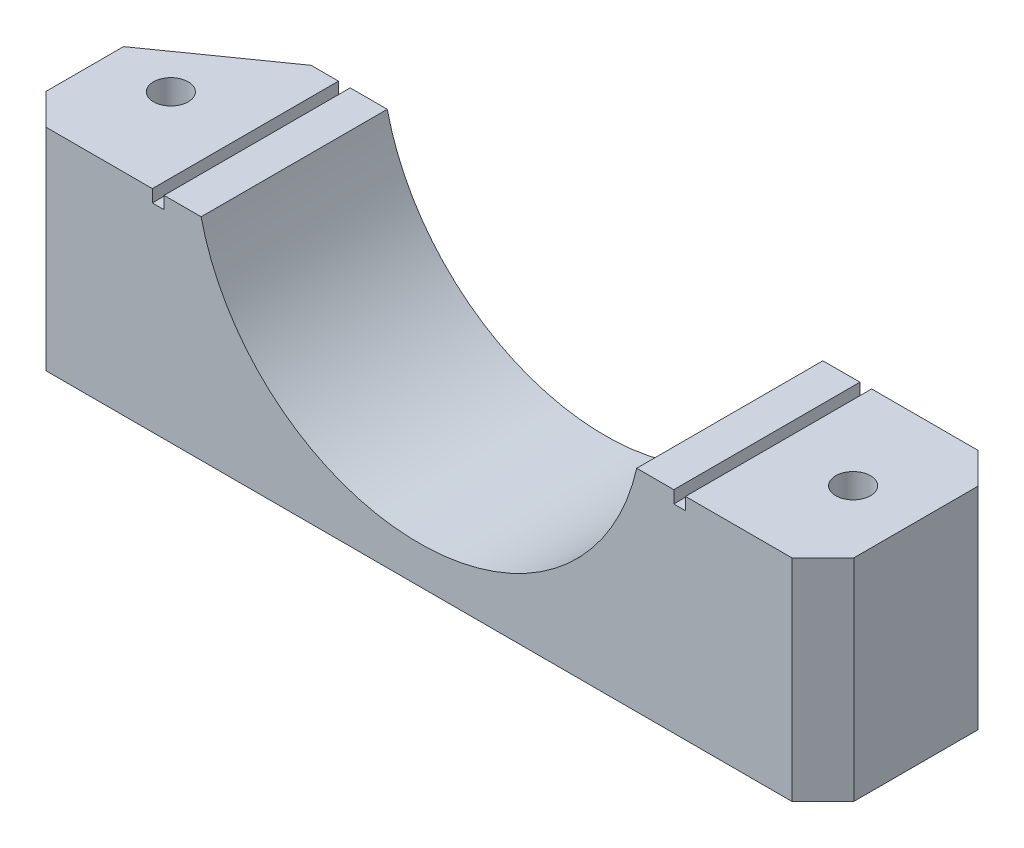
ISO-10303-21;
HEADER;
FILE_DESCRIPTION(('STEP AP214'),'2;1');
FILE_NAME('part.step','',(''),(''),'','','');
FILE_SCHEMA(('AUTOMOTIVE_DESIGN { 1 0 10303 214 1 1 1 1 }'));
ENDSEC;
DATA;
#1=APPLICATION_CONTEXT('core data for automotive mechanical design processes');
#2=APPLICATION_PROTOCOL_DEFINITION('international standard','automotive_design',2000,#1);
#3=PRODUCT_CONTEXT('',#1,'mechanical');
#4=PRODUCT('Part','Part','',(#3));
#5=PRODUCT_RELATED_PRODUCT_CATEGORY('part','',(#4));
#6=PRODUCT_DEFINITION_FORMATION('','',#4);
#7=PRODUCT_DEFINITION_CONTEXT('part definition',#1,'design');
#8=PRODUCT_DEFINITION('design','',#6,#7);
#9=PRODUCT_DEFINITION_SHAPE('','',#8);
#10=(LENGTH_UNIT() NAMED_UNIT(*) SI_UNIT(.MILLI.,.METRE.));
#11=(NAMED_UNIT(*) PLANE_ANGLE_UNIT() SI_UNIT($,.RADIAN.));
#12=(NAMED_UNIT(*) SI_UNIT($,.STERADIAN.) SOLID_ANGLE_UNIT());
#13=UNCERTAINTY_MEASURE_WITH_UNIT(LENGTH_MEASURE(1.E-05),#10,'distance_accuracy_value','');
#14=(GEOMETRIC_REPRESENTATION_CONTEXT(3) GLOBAL_UNCERTAINTY_ASSIGNED_CONTEXT((#13)) GLOBAL_UNIT_ASSIGNED_CONTEXT((#10,
#11,#12)) REPRESENTATION_CONTEXT('',''));
#15=CARTESIAN_POINT('',(0.,0.,0.));
#16=DIRECTION('',(0.,0.,1.));
#17=DIRECTION('',(1.,0.,0.));
#18=AXIS2_PLACEMENT_3D('',#15,#16,#17);
#19=CARTESIAN_POINT('',(32.5499287747842,-4.,15.));
#20=DIRECTION('',(0.,-1.,0.));
#21=DIRECTION('',(1.,0.,0.));
#22=AXIS2_PLACEMENT_3D('',#19,#20,#21);
#23=PLANE('',#22);
#24=CARTESIAN_POINT('',(27.4886444805463,-4.,7.50000000000003));
#25=DIRECTION('',(0.,1.,0.));
#26=DIRECTION('',(-1.,0.,0.));
#27=AXIS2_PLACEMENT_3D('',#24,#25,#26);
#28=CIRCLE('',#27,1.4);
#29=CARTESIAN_POINT('',(26.0886444805463,-4.,7.50000000000003));
#30=VERTEX_POINT('',#29);
#31=EDGE_CURVE('E292',#30,#30,#28,.T.);
#32=ORIENTED_EDGE('',*,*,#31,.F.);
#33=EDGE_LOOP('',(#32));
#34=FACE_BOUND('',#33,.T.);
#35=DIRECTION('',(0.,0.,1.));
#36=VECTOR('',#35,1.);
#37=CARTESIAN_POINT('',(21.4797362047984,-4.,0.));
#38=LINE('',#37,#36);
#39=CARTESIAN_POINT('',(21.4797362047984,-4.,0.));
#40=VERTEX_POINT('',#39);
#41=CARTESIAN_POINT('',(21.4797362047984,-4.,15.));
#42=VERTEX_POINT('',#41);
#43=EDGE_CURVE('E406',#40,#42,#38,.T.);
#44=ORIENTED_EDGE('',*,*,#43,.T.);
#45=DIRECTION('',(-1.,0.,0.));
#46=VECTOR('',#45,1.);
#47=CARTESIAN_POINT('',(32.5499287747842,-4.,15.));
#48=LINE('',#47,#46);
#49=CARTESIAN_POINT('',(30.0499287747842,-4.,15.));
#50=VERTEX_POINT('',#49);
#51=EDGE_CURVE('E190',#50,#42,#48,.T.);
#52=ORIENTED_EDGE('',*,*,#51,.F.);
#53=DIRECTION('',(0.707106781186548,0.,-0.707106781186548));
#54=VECTOR('',#53,1.);
#55=CARTESIAN_POINT('',(30.0499287747842,-4.,15.));
#56=LINE('',#55,#54);
#57=CARTESIAN_POINT('',(32.5499287747842,-4.,12.5));
#58=VERTEX_POINT('',#57);
#59=EDGE_CURVE('E218',#50,#58,#56,.T.);
#60=ORIENTED_EDGE('',*,*,#59,.T.);
#61=DIRECTION('',(0.,0.,-1.));
#62=VECTOR('',#61,1.);
#63=CARTESIAN_POINT('',(32.5499287747842,-4.,15.));
#64=LINE('',#63,#62);
#65=CARTESIAN_POINT('',(32.5499287747842,-4.,2.5));
#66=VERTEX_POINT('',#65);
#67=EDGE_CURVE('E210',#58,#66,#64,.T.);
#68=ORIENTED_EDGE('',*,*,#67,.T.);
#69=DIRECTION('',(0.707106781186548,0.,0.707106781186547));
#70=VECTOR('',#69,1.);
#71=CARTESIAN_POINT('',(32.5499287747842,-4.,2.5));
#72=LINE('',#71,#70);
#73=CARTESIAN_POINT('',(30.0499287747842,-4.,0.));
#74=VERTEX_POINT('',#73);
#75=EDGE_CURVE('E220',#66,#74,#72,.F.);
#76=ORIENTED_EDGE('',*,*,#75,.T.);
#77=DIRECTION('',(-1.,0.,0.));
#78=VECTOR('',#77,1.);
#79=CARTESIAN_POINT('',(32.5499287747842,-4.,0.));
#80=LINE('',#79,#78);
#81=EDGE_CURVE('E262',#74,#40,#80,.T.);
#82=ORIENTED_EDGE('',*,*,#81,.T.);
#83=EDGE_LOOP('',(#44,#52,#60,#68,#76,#82));
#84=FACE_BOUND('',#83,.T.);
#85=ADVANCED_FACE('F43',(#34,#84),#23,.F.);
#86=CARTESIAN_POINT('',(-17.5499287747842,-4.,15.));
#87=DIRECTION('',(0.,-1.,0.));
#88=DIRECTION('',(1.,0.,0.));
#89=AXIS2_PLACEMENT_3D('',#86,#87,#88);
#90=PLANE('',#89);
#91=DIRECTION('',(0.,0.,1.));
#92=VECTOR('',#91,1.);
#93=CARTESIAN_POINT('',(-20.5370518572524,-4.,0.));
#94=LINE('',#93,#92);
#95=CARTESIAN_POINT('',(-20.5370518572524,-4.,0.));
#96=VERTEX_POINT('',#95);
#97=CARTESIAN_POINT('',(-20.5370518572524,-4.,15.));
#98=VERTEX_POINT('',#97);
#99=EDGE_CURVE('E324',#96,#98,#94,.T.);
#100=ORIENTED_EDGE('',*,*,#99,.T.);
#101=DIRECTION('',(-1.,0.,0.));
#102=VECTOR('',#101,1.);
#103=CARTESIAN_POINT('',(-17.5499287747842,-4.,15.));
#104=LINE('',#103,#102);
#105=CARTESIAN_POINT('',(-17.5499287747842,-4.,15.));
#106=VERTEX_POINT('',#105);
#107=EDGE_CURVE('E256',#106,#98,#104,.T.);
#108=ORIENTED_EDGE('',*,*,#107,.F.);
#109=DIRECTION('',(0.,0.,-1.));
#110=VECTOR('',#109,1.);
#111=CARTESIAN_POINT('',(-17.5499287747842,-4.,15.));
#112=LINE('',#111,#110);
#113=CARTESIAN_POINT('',(-17.5499287747842,-4.,0.));
#114=VERTEX_POINT('',#113);
#115=EDGE_CURVE('E205',#106,#114,#112,.T.);
#116=ORIENTED_EDGE('',*,*,#115,.T.);
#117=DIRECTION('',(-1.,0.,0.));
#118=VECTOR('',#117,1.);
#119=CARTESIAN_POINT('',(-17.5499287747842,-4.,0.));
#120=LINE('',#119,#118);
#121=EDGE_CURVE('E188',#114,#96,#120,.T.);
#122=ORIENTED_EDGE('',*,*,#121,.T.);
#123=EDGE_LOOP('',(#100,#108,#116,#122));
#124=FACE_BOUND('',#123,.T.);
#125=ADVANCED_FACE('F349',(#124),#90,.F.);
#126=CARTESIAN_POINT('',(32.5499287747842,-21.,15.));
#127=DIRECTION('',(-1.,0.,0.));
#128=DIRECTION('',(0.,0.,1.));
#129=AXIS2_PLACEMENT_3D('',#126,#127,#128);
#130=PLANE('',#129);
#131=DIRECTION('',(0.,0.,-1.));
#132=VECTOR('',#131,1.);
#133=CARTESIAN_POINT('',(32.5499287747842,-21.,15.));
#134=LINE('',#133,#132);
#135=CARTESIAN_POINT('',(32.5499287747842,-21.,12.5));
#136=VERTEX_POINT('',#135);
#137=CARTESIAN_POINT('',(32.5499287747842,-21.,2.5));
#138=VERTEX_POINT('',#137);
#139=EDGE_CURVE('E197',#136,#138,#134,.T.);
#140=ORIENTED_EDGE('',*,*,#139,.T.);
#141=DIRECTION('',(0.,1.,0.));
#142=VECTOR('',#141,1.);
#143=CARTESIAN_POINT('',(32.5499287747842,-21.,2.5));
#144=LINE('',#143,#142);
#145=EDGE_CURVE('E215',#138,#66,#144,.T.);
#146=ORIENTED_EDGE('',*,*,#145,.T.);
#147=ORIENTED_EDGE('',*,*,#67,.F.);
#148=DIRECTION('',(0.,-1.,0.));
#149=VECTOR('',#148,1.);
#150=CARTESIAN_POINT('',(32.5499287747842,-21.,12.5));
#151=LINE('',#150,#149);
#152=EDGE_CURVE('E213',#58,#136,#151,.T.);
#153=ORIENTED_EDGE('',*,*,#152,.T.);
#154=EDGE_LOOP('',(#140,#146,#147,#153));
#155=FACE_BOUND('',#154,.T.);
#156=ADVANCED_FACE('F351',(#155),#130,.F.);
#157=CARTESIAN_POINT('',(20.5370518572524,-4.,15.));
#158=VERTEX_POINT('',#157);
#159=CARTESIAN_POINT('',(17.5499287747842,-4.,15.));
#160=VERTEX_POINT('',#159);
#161=EDGE_CURVE('E187',#158,#160,#48,.T.);
#162=ORIENTED_EDGE('',*,*,#161,.F.);
#163=DIRECTION('',(0.,0.,1.));
#164=VECTOR('',#163,1.);
#165=CARTESIAN_POINT('',(20.5370518572524,-4.,0.));
#166=LINE('',#165,#164);
#167=CARTESIAN_POINT('',(20.5370518572524,-4.,0.));
#168=VERTEX_POINT('',#167);
#169=EDGE_CURVE('E314',#168,#158,#166,.T.);
#170=ORIENTED_EDGE('',*,*,#169,.F.);
#171=CARTESIAN_POINT('',(17.5499287747842,-4.,0.));
#172=VERTEX_POINT('',#171);
#173=EDGE_CURVE('E265',#168,#172,#80,.T.);
#174=ORIENTED_EDGE('',*,*,#173,.T.);
#175=DIRECTION('',(0.,0.,-1.));
#176=VECTOR('',#175,1.);
#177=CARTESIAN_POINT('',(17.5499287747842,-4.,15.));
#178=LINE('',#177,#176);
#179=EDGE_CURVE('E207',#160,#172,#178,.T.);
#180=ORIENTED_EDGE('',*,*,#179,.F.);
#181=EDGE_LOOP('',(#162,#170,#174,#180));
#182=FACE_BOUND('',#181,.T.);
#183=ADVANCED_FACE('F313',(#182),#23,.F.);
#184=CARTESIAN_POINT('',(0.,0.,15.));
#185=DIRECTION('',(0.,0.,-1.));
#186=DIRECTION('',(-1.,0.,0.));
#187=AXIS2_PLACEMENT_3D('',#184,#185,#186);
#188=CYLINDRICAL_SURFACE('',#187,18.);
#189=CARTESIAN_POINT('',(0.,0.,0.));
#190=DIRECTION('',(0.,0.,1.));
#191=DIRECTION('',(1.,0.,0.));
#192=AXIS2_PLACEMENT_3D('',#189,#190,#191);
#193=CIRCLE('',#192,18.);
#194=EDGE_CURVE('E264',#114,#172,#193,.T.);
#195=ORIENTED_EDGE('',*,*,#194,.F.);
#196=ORIENTED_EDGE('',*,*,#115,.F.);
#197=CARTESIAN_POINT('',(0.,0.,15.));
#198=DIRECTION('',(0.,0.,1.));
#199=DIRECTION('',(1.,0.,0.));
#200=AXIS2_PLACEMENT_3D('',#197,#198,#199);
#201=CIRCLE('',#200,18.);
#202=EDGE_CURVE('E300',#106,#160,#201,.T.);
#203=ORIENTED_EDGE('',*,*,#202,.T.);
#204=ORIENTED_EDGE('',*,*,#179,.T.);
#205=EDGE_LOOP('',(#195,#196,#203,#204));
#206=FACE_BOUND('',#205,.T.);
#207=ADVANCED_FACE('F304',(#206),#188,.F.);
#208=CARTESIAN_POINT('',(-27.4886444805463,-4.00000000000002,7.50000000000003));
#209=DIRECTION('',(0.,1.,0.));
#210=DIRECTION('',(1.,0.,0.));
#211=AXIS2_PLACEMENT_3D('',#208,#209,#210);
#212=CIRCLE('',#211,1.4);
#213=CARTESIAN_POINT('',(-26.0886444805463,-4.00000000000002,7.50000000000003));
#214=VERTEX_POINT('',#213);
#215=EDGE_CURVE('E295',#214,#214,#212,.T.);
#216=ORIENTED_EDGE('',*,*,#215,.F.);
#217=EDGE_LOOP('',(#216));
#218=FACE_BOUND('',#217,.T.);
#219=CARTESIAN_POINT('',(-21.4797362047984,-4.,0.));
#220=VERTEX_POINT('',#219);
#221=CARTESIAN_POINT('',(-23.6830969203936,-4.,0.));
#222=VERTEX_POINT('',#221);
#223=EDGE_CURVE('E193',#220,#222,#120,.T.);
#224=ORIENTED_EDGE('',*,*,#223,.T.);
#225=DIRECTION('',(-0.817355943758289,0.,0.576133023878164));
#226=VECTOR('',#225,1.);
#227=CARTESIAN_POINT('',(-26.6492930181239,-4.,2.09079476359242));
#228=LINE('',#227,#226);
#229=CARTESIAN_POINT('',(-32.5499287747842,-4.,6.25));
#230=VERTEX_POINT('',#229);
#231=EDGE_CURVE('E59',#222,#230,#228,.T.);
#232=ORIENTED_EDGE('',*,*,#231,.T.);
#233=DIRECTION('',(0.,0.,-1.));
#234=VECTOR('',#233,1.);
#235=CARTESIAN_POINT('',(-32.5499287747842,-4.,15.));
#236=LINE('',#235,#234);
#237=CARTESIAN_POINT('',(-32.5499287747842,-4.,12.5));
#238=VERTEX_POINT('',#237);
#239=EDGE_CURVE('E202',#238,#230,#236,.T.);
#240=ORIENTED_EDGE('',*,*,#239,.F.);
#241=DIRECTION('',(0.707106781186548,0.,0.707106781186548));
#242=VECTOR('',#241,1.);
#243=CARTESIAN_POINT('',(-30.0499287747842,-4.,15.));
#244=LINE('',#243,#242);
#245=CARTESIAN_POINT('',(-30.0499287747842,-4.,15.));
#246=VERTEX_POINT('',#245);
#247=EDGE_CURVE('E52',#238,#246,#244,.T.);
#248=ORIENTED_EDGE('',*,*,#247,.T.);
#249=CARTESIAN_POINT('',(-21.4797362047984,-4.,15.));
#250=VERTEX_POINT('',#249);
#251=EDGE_CURVE('E244',#250,#246,#104,.T.);
#252=ORIENTED_EDGE('',*,*,#251,.F.);
#253=DIRECTION('',(0.,0.,1.));
#254=VECTOR('',#253,1.);
#255=CARTESIAN_POINT('',(-21.4797362047984,-4.,0.));
#256=LINE('',#255,#254);
#257=EDGE_CURVE('E270',#220,#250,#256,.T.);
#258=ORIENTED_EDGE('',*,*,#257,.F.);
#259=EDGE_LOOP('',(#224,#232,#240,#248,#252,#258));
#260=FACE_BOUND('',#259,.T.);
#261=ADVANCED_FACE('F242',(#218,#260),#90,.F.);
#262=CARTESIAN_POINT('',(-32.5499287747842,-4.,15.));
#263=DIRECTION('',(1.,0.,0.));
#264=DIRECTION('',(0.,0.,-1.));
#265=AXIS2_PLACEMENT_3D('',#262,#263,#264);
#266=PLANE('',#265);
#267=ORIENTED_EDGE('',*,*,#239,.T.);
#268=DIRECTION('',(0.,-1.,0.));
#269=VECTOR('',#268,1.);
#270=CARTESIAN_POINT('',(-32.5499287747842,3.99999999999999,6.25));
#271=LINE('',#270,#269);
#272=CARTESIAN_POINT('',(-32.5499287747842,-21.,6.25));
#273=VERTEX_POINT('',#272);
#274=EDGE_CURVE('E180',#230,#273,#271,.T.);
#275=ORIENTED_EDGE('',*,*,#274,.T.);
#276=DIRECTION('',(0.,0.,-1.));
#277=VECTOR('',#276,1.);
#278=CARTESIAN_POINT('',(-32.5499287747842,-21.,15.));
#279=LINE('',#278,#277);
#280=CARTESIAN_POINT('',(-32.5499287747842,-21.,12.5));
#281=VERTEX_POINT('',#280);
#282=EDGE_CURVE('E179',#281,#273,#279,.T.);
#283=ORIENTED_EDGE('',*,*,#282,.F.);
#284=DIRECTION('',(0.,1.,0.));
#285=VECTOR('',#284,1.);
#286=CARTESIAN_POINT('',(-32.5499287747842,-4.,12.5));
#287=LINE('',#286,#285);
#288=EDGE_CURVE('E235',#281,#238,#287,.T.);
#289=ORIENTED_EDGE('',*,*,#288,.T.);
#290=EDGE_LOOP('',(#267,#275,#283,#289));
#291=FACE_BOUND('',#290,.T.);
#292=ADVANCED_FACE('F366',(#291),#266,.F.);
#293=CARTESIAN_POINT('',(-32.5499287747842,-21.,15.));
#294=DIRECTION('',(0.,1.,0.));
#295=DIRECTION('',(0.,0.,1.));
#296=AXIS2_PLACEMENT_3D('',#293,#294,#295);
#297=PLANE('',#296);
#298=CARTESIAN_POINT('',(27.4886444805463,-21.,7.50000000000003));
#299=DIRECTION('',(0.,1.,0.));
#300=DIRECTION('',(-1.,0.,0.));
#301=AXIS2_PLACEMENT_3D('',#298,#299,#300);
#302=CIRCLE('',#301,1.4);
#303=CARTESIAN_POINT('',(26.0886444805463,-21.,7.50000000000003));
#304=VERTEX_POINT('',#303);
#305=EDGE_CURVE('E289',#304,#304,#302,.T.);
#306=ORIENTED_EDGE('',*,*,#305,.T.);
#307=EDGE_LOOP('',(#306));
#308=FACE_BOUND('',#307,.T.);
#309=CARTESIAN_POINT('',(-27.4886444805463,-21.,7.50000000000003));
#310=DIRECTION('',(0.,1.,0.));
#311=DIRECTION('',(1.,0.,0.));
#312=AXIS2_PLACEMENT_3D('',#309,#310,#311);
#313=CIRCLE('',#312,1.4);
#314=CARTESIAN_POINT('',(-26.0886444805463,-21.,7.50000000000003));
#315=VERTEX_POINT('',#314);
#316=EDGE_CURVE('E281',#315,#315,#313,.T.);
#317=ORIENTED_EDGE('',*,*,#316,.T.);
#318=EDGE_LOOP('',(#317));
#319=FACE_BOUND('',#318,.T.);
#320=ORIENTED_EDGE('',*,*,#282,.T.);
#321=DIRECTION('',(-0.817355943758289,0.,0.576133023878164));
#322=VECTOR('',#321,1.);
#323=CARTESIAN_POINT('',(-23.6830969203936,-21.,0.));
#324=LINE('',#323,#322);
#325=CARTESIAN_POINT('',(-23.6830969203936,-21.,0.));
#326=VERTEX_POINT('',#325);
#327=EDGE_CURVE('E167',#326,#273,#324,.T.);
#328=ORIENTED_EDGE('',*,*,#327,.F.);
#329=DIRECTION('',(1.,0.,0.));
#330=VECTOR('',#329,1.);
#331=CARTESIAN_POINT('',(-32.5499287747842,-21.,0.));
#332=LINE('',#331,#330);
#333=CARTESIAN_POINT('',(30.0499287747842,-21.,0.));
#334=VERTEX_POINT('',#333);
#335=EDGE_CURVE('E176',#326,#334,#332,.T.);
#336=ORIENTED_EDGE('',*,*,#335,.T.);
#337=DIRECTION('',(-0.707106781186548,0.,-0.707106781186547));
#338=VECTOR('',#337,1.);
#339=CARTESIAN_POINT('',(32.5499287747842,-21.,2.5));
#340=LINE('',#339,#338);
#341=EDGE_CURVE('E227',#334,#138,#340,.F.);
#342=ORIENTED_EDGE('',*,*,#341,.T.);
#343=ORIENTED_EDGE('',*,*,#139,.F.);
#344=DIRECTION('',(-0.707106781186548,0.,0.707106781186548));
#345=VECTOR('',#344,1.);
#346=CARTESIAN_POINT('',(30.0499287747842,-21.,15.));
#347=LINE('',#346,#345);
#348=CARTESIAN_POINT('',(30.0499287747842,-21.,15.));
#349=VERTEX_POINT('',#348);
#350=EDGE_CURVE('E225',#136,#349,#347,.T.);
#351=ORIENTED_EDGE('',*,*,#350,.T.);
#352=DIRECTION('',(1.,0.,0.));
#353=VECTOR('',#352,1.);
#354=CARTESIAN_POINT('',(-32.5499287747842,-21.,15.));
#355=LINE('',#354,#353);
#356=CARTESIAN_POINT('',(-30.0499287747842,-21.,15.));
#357=VERTEX_POINT('',#356);
#358=EDGE_CURVE('E200',#357,#349,#355,.T.);
#359=ORIENTED_EDGE('',*,*,#358,.F.);
#360=DIRECTION('',(-0.707106781186548,0.,-0.707106781186548));
#361=VECTOR('',#360,1.);
#362=CARTESIAN_POINT('',(-30.0499287747842,-21.,15.));
#363=LINE('',#362,#361);
#364=EDGE_CURVE('E223',#357,#281,#363,.T.);
#365=ORIENTED_EDGE('',*,*,#364,.T.);
#366=EDGE_LOOP('',(#320,#328,#336,#342,#343,#351,#359,#365));
#367=FACE_BOUND('',#366,.T.);
#368=ADVANCED_FACE('F175',(#308,#319,#367),#297,.F.);
#369=CARTESIAN_POINT('',(0.,0.,15.));
#370=DIRECTION('',(0.,0.,1.));
#371=DIRECTION('',(1.,0.,0.));
#372=AXIS2_PLACEMENT_3D('',#369,#370,#371);
#373=PLANE('',#372);
#374=DIRECTION('',(0.,1.,0.));
#375=VECTOR('',#374,1.);
#376=CARTESIAN_POINT('',(20.5370518572524,-5.,15.));
#377=LINE('',#376,#375);
#378=CARTESIAN_POINT('',(20.5370518572524,-5.,15.));
#379=VERTEX_POINT('',#378);
#380=EDGE_CURVE('E310',#379,#158,#377,.T.);
#381=ORIENTED_EDGE('',*,*,#380,.T.);
#382=ORIENTED_EDGE('',*,*,#161,.T.);
#383=ORIENTED_EDGE('',*,*,#202,.F.);
#384=ORIENTED_EDGE('',*,*,#107,.T.);
#385=DIRECTION('',(0.,1.,0.));
#386=VECTOR('',#385,1.);
#387=CARTESIAN_POINT('',(-20.5370518572524,-5.,15.));
#388=LINE('',#387,#386);
#389=CARTESIAN_POINT('',(-20.5370518572524,-5.,15.));
#390=VERTEX_POINT('',#389);
#391=EDGE_CURVE('E283',#390,#98,#388,.T.);
#392=ORIENTED_EDGE('',*,*,#391,.F.);
#393=DIRECTION('',(1.,0.,0.));
#394=VECTOR('',#393,1.);
#395=CARTESIAN_POINT('',(-21.4797362047984,-5.,15.));
#396=LINE('',#395,#394);
#397=CARTESIAN_POINT('',(-21.4797362047984,-5.,15.));
#398=VERTEX_POINT('',#397);
#399=EDGE_CURVE('E332',#398,#390,#396,.T.);
#400=ORIENTED_EDGE('',*,*,#399,.F.);
#401=DIRECTION('',(0.,1.,0.));
#402=VECTOR('',#401,1.);
#403=CARTESIAN_POINT('',(-21.4797362047984,-5.,15.));
#404=LINE('',#403,#402);
#405=EDGE_CURVE('E278',#398,#250,#404,.T.);
#406=ORIENTED_EDGE('',*,*,#405,.T.);
#407=ORIENTED_EDGE('',*,*,#251,.T.);
#408=DIRECTION('',(0.,-1.,0.));
#409=VECTOR('',#408,1.);
#410=CARTESIAN_POINT('',(-30.0499287747842,-21.,15.));
#411=LINE('',#410,#409);
#412=EDGE_CURVE('E229',#246,#357,#411,.T.);
#413=ORIENTED_EDGE('',*,*,#412,.T.);
#414=ORIENTED_EDGE('',*,*,#358,.T.);
#415=DIRECTION('',(0.,1.,0.));
#416=VECTOR('',#415,1.);
#417=CARTESIAN_POINT('',(30.0499287747842,-4.,15.));
#418=LINE('',#417,#416);
#419=EDGE_CURVE('E232',#349,#50,#418,.T.);
#420=ORIENTED_EDGE('',*,*,#419,.T.);
#421=ORIENTED_EDGE('',*,*,#51,.T.);
#422=DIRECTION('',(0.,1.,0.));
#423=VECTOR('',#422,1.);
#424=CARTESIAN_POINT('',(21.4797362047984,-5.,15.));
#425=LINE('',#424,#423);
#426=CARTESIAN_POINT('',(21.4797362047984,-5.,15.));
#427=VERTEX_POINT('',#426);
#428=EDGE_CURVE('E326',#427,#42,#425,.T.);
#429=ORIENTED_EDGE('',*,*,#428,.F.);
#430=DIRECTION('',(-1.,0.,0.));
#431=VECTOR('',#430,1.);
#432=CARTESIAN_POINT('',(21.4797362047984,-5.,15.));
#433=LINE('',#432,#431);
#434=EDGE_CURVE('E416',#427,#379,#433,.T.);
#435=ORIENTED_EDGE('',*,*,#434,.T.);
#436=EDGE_LOOP('',(#381,#382,#383,#384,#392,#400,#406,#407,#413,#414,#420,#421,#429,#435));
#437=FACE_BOUND('',#436,.T.);
#438=ADVANCED_FACE('F251',(#437),#373,.T.);
#439=CARTESIAN_POINT('',(0.,0.,0.));
#440=DIRECTION('',(0.,0.,1.));
#441=DIRECTION('',(1.,0.,0.));
#442=AXIS2_PLACEMENT_3D('',#439,#440,#441);
#443=PLANE('',#442);
#444=ORIENTED_EDGE('',*,*,#335,.F.);
#445=DIRECTION('',(0.,1.,0.));
#446=VECTOR('',#445,1.);
#447=CARTESIAN_POINT('',(-23.6830969203936,0.,0.));
#448=LINE('',#447,#446);
#449=EDGE_CURVE('E11',#326,#222,#448,.T.);
#450=ORIENTED_EDGE('',*,*,#449,.T.);
#451=ORIENTED_EDGE('',*,*,#223,.F.);
#452=DIRECTION('',(0.,1.,0.));
#453=VECTOR('',#452,1.);
#454=CARTESIAN_POINT('',(-21.4797362047984,-5.,0.));
#455=LINE('',#454,#453);
#456=CARTESIAN_POINT('',(-21.4797362047984,-5.,0.));
#457=VERTEX_POINT('',#456);
#458=EDGE_CURVE('E273',#457,#220,#455,.T.);
#459=ORIENTED_EDGE('',*,*,#458,.F.);
#460=DIRECTION('',(1.,0.,0.));
#461=VECTOR('',#460,1.);
#462=CARTESIAN_POINT('',(-21.4797362047984,-5.,0.));
#463=LINE('',#462,#461);
#464=CARTESIAN_POINT('',(-20.5370518572524,-5.,0.));
#465=VERTEX_POINT('',#464);
#466=EDGE_CURVE('E275',#457,#465,#463,.T.);
#467=ORIENTED_EDGE('',*,*,#466,.T.);
#468=DIRECTION('',(0.,1.,0.));
#469=VECTOR('',#468,1.);
#470=CARTESIAN_POINT('',(-20.5370518572524,-5.,0.));
#471=LINE('',#470,#469);
#472=EDGE_CURVE('E279',#465,#96,#471,.T.);
#473=ORIENTED_EDGE('',*,*,#472,.T.);
#474=ORIENTED_EDGE('',*,*,#121,.F.);
#475=ORIENTED_EDGE('',*,*,#194,.T.);
#476=ORIENTED_EDGE('',*,*,#173,.F.);
#477=DIRECTION('',(0.,1.,0.));
#478=VECTOR('',#477,1.);
#479=CARTESIAN_POINT('',(20.5370518572524,-5.,0.));
#480=LINE('',#479,#478);
#481=CARTESIAN_POINT('',(20.5370518572524,-5.,0.));
#482=VERTEX_POINT('',#481);
#483=EDGE_CURVE('E317',#482,#168,#480,.T.);
#484=ORIENTED_EDGE('',*,*,#483,.F.);
#485=DIRECTION('',(-1.,0.,0.));
#486=VECTOR('',#485,1.);
#487=CARTESIAN_POINT('',(21.4797362047984,-5.,0.));
#488=LINE('',#487,#486);
#489=CARTESIAN_POINT('',(21.4797362047984,-5.,0.));
#490=VERTEX_POINT('',#489);
#491=EDGE_CURVE('E319',#490,#482,#488,.T.);
#492=ORIENTED_EDGE('',*,*,#491,.F.);
#493=DIRECTION('',(0.,1.,0.));
#494=VECTOR('',#493,1.);
#495=CARTESIAN_POINT('',(21.4797362047984,-5.,0.));
#496=LINE('',#495,#494);
#497=EDGE_CURVE('E322',#490,#40,#496,.T.);
#498=ORIENTED_EDGE('',*,*,#497,.T.);
#499=ORIENTED_EDGE('',*,*,#81,.F.);
#500=DIRECTION('',(0.,-1.,0.));
#501=VECTOR('',#500,1.);
#502=CARTESIAN_POINT('',(30.0499287747842,0.,0.));
#503=LINE('',#502,#501);
#504=EDGE_CURVE('E185',#74,#334,#503,.T.);
#505=ORIENTED_EDGE('',*,*,#504,.T.);
#506=EDGE_LOOP('',(#444,#450,#451,#459,#467,#473,#474,#475,#476,#484,#492,#498,#499,#505));
#507=FACE_BOUND('',#506,.T.);
#508=ADVANCED_FACE('F182',(#507),#443,.F.);
#509=CARTESIAN_POINT('',(32.5499287747842,-21.,2.5));
#510=DIRECTION('',(-0.707106781186547,0.,0.707106781186548));
#511=DIRECTION('',(0.,1.,0.));
#512=AXIS2_PLACEMENT_3D('',#509,#510,#511);
#513=PLANE('',#512);
#514=ORIENTED_EDGE('',*,*,#341,.F.);
#515=ORIENTED_EDGE('',*,*,#504,.F.);
#516=ORIENTED_EDGE('',*,*,#75,.F.);
#517=ORIENTED_EDGE('',*,*,#145,.F.);
#518=EDGE_LOOP('',(#514,#515,#516,#517));
#519=FACE_BOUND('',#518,.T.);
#520=ADVANCED_FACE('F394',(#519),#513,.F.);
#521=CARTESIAN_POINT('',(30.0499287747842,0.,15.));
#522=DIRECTION('',(0.707106781186547,0.,0.707106781186547));
#523=DIRECTION('',(0.,-1.,0.));
#524=AXIS2_PLACEMENT_3D('',#521,#522,#523);
#525=PLANE('',#524);
#526=ORIENTED_EDGE('',*,*,#350,.F.);
#527=ORIENTED_EDGE('',*,*,#152,.F.);
#528=ORIENTED_EDGE('',*,*,#59,.F.);
#529=ORIENTED_EDGE('',*,*,#419,.F.);
#530=EDGE_LOOP('',(#526,#527,#528,#529));
#531=FACE_BOUND('',#530,.T.);
#532=ADVANCED_FACE('F386',(#531),#525,.T.);
#533=CARTESIAN_POINT('',(-30.0499287747842,0.,15.));
#534=DIRECTION('',(-0.707106781186547,0.,0.707106781186547));
#535=DIRECTION('',(0.,1.,0.));
#536=AXIS2_PLACEMENT_3D('',#533,#534,#535);
#537=PLANE('',#536);
#538=ORIENTED_EDGE('',*,*,#247,.F.);
#539=ORIENTED_EDGE('',*,*,#288,.F.);
#540=ORIENTED_EDGE('',*,*,#364,.F.);
#541=ORIENTED_EDGE('',*,*,#412,.F.);
#542=EDGE_LOOP('',(#538,#539,#540,#541));
#543=FACE_BOUND('',#542,.T.);
#544=ADVANCED_FACE('F46',(#543),#537,.T.);
#545=CARTESIAN_POINT('',(-27.4886444805463,-21.,7.50000000000003));
#546=DIRECTION('',(0.,1.,0.));
#547=DIRECTION('',(-1.,0.,0.));
#548=AXIS2_PLACEMENT_3D('',#545,#546,#547);
#549=CYLINDRICAL_SURFACE('',#548,1.4);
#550=ORIENTED_EDGE('',*,*,#316,.F.);
#551=EDGE_LOOP('',(#550));
#552=FACE_BOUND('',#551,.T.);
#553=ORIENTED_EDGE('',*,*,#215,.T.);
#554=EDGE_LOOP('',(#553));
#555=FACE_BOUND('',#554,.T.);
#556=ADVANCED_FACE('F376',(#552,#555),#549,.F.);
#557=CARTESIAN_POINT('',(27.4886444805463,-21.,7.50000000000003));
#558=DIRECTION('',(0.,1.,0.));
#559=DIRECTION('',(-1.,0.,0.));
#560=AXIS2_PLACEMENT_3D('',#557,#558,#559);
#561=CYLINDRICAL_SURFACE('',#560,1.4);
#562=ORIENTED_EDGE('',*,*,#305,.F.);
#563=EDGE_LOOP('',(#562));
#564=FACE_BOUND('',#563,.T.);
#565=ORIENTED_EDGE('',*,*,#31,.T.);
#566=EDGE_LOOP('',(#565));
#567=FACE_BOUND('',#566,.T.);
#568=ADVANCED_FACE('F378',(#564,#567),#561,.F.);
#569=CARTESIAN_POINT('',(-21.4797362047984,-5.,0.));
#570=DIRECTION('',(-1.,0.,0.));
#571=DIRECTION('',(0.,-1.,0.));
#572=AXIS2_PLACEMENT_3D('',#569,#570,#571);
#573=PLANE('',#572);
#574=ORIENTED_EDGE('',*,*,#257,.T.);
#575=ORIENTED_EDGE('',*,*,#405,.F.);
#576=DIRECTION('',(0.,0.,1.));
#577=VECTOR('',#576,1.);
#578=CARTESIAN_POINT('',(-21.4797362047984,-5.,0.));
#579=LINE('',#578,#577);
#580=EDGE_CURVE('E288',#457,#398,#579,.T.);
#581=ORIENTED_EDGE('',*,*,#580,.F.);
#582=ORIENTED_EDGE('',*,*,#458,.T.);
#583=EDGE_LOOP('',(#574,#575,#581,#582));
#584=FACE_BOUND('',#583,.T.);
#585=ADVANCED_FACE('F341',(#584),#573,.F.);
#586=CARTESIAN_POINT('',(-20.5370518572524,-5.,0.));
#587=DIRECTION('',(-1.,0.,0.));
#588=DIRECTION('',(0.,-1.,0.));
#589=AXIS2_PLACEMENT_3D('',#586,#587,#588);
#590=PLANE('',#589);
#591=ORIENTED_EDGE('',*,*,#99,.F.);
#592=ORIENTED_EDGE('',*,*,#472,.F.);
#593=DIRECTION('',(0.,0.,1.));
#594=VECTOR('',#593,1.);
#595=CARTESIAN_POINT('',(-20.5370518572524,-5.,0.));
#596=LINE('',#595,#594);
#597=EDGE_CURVE('E335',#465,#390,#596,.T.);
#598=ORIENTED_EDGE('',*,*,#597,.T.);
#599=ORIENTED_EDGE('',*,*,#391,.T.);
#600=EDGE_LOOP('',(#591,#592,#598,#599));
#601=FACE_BOUND('',#600,.T.);
#602=ADVANCED_FACE('F347',(#601),#590,.T.);
#603=CARTESIAN_POINT('',(0.,-5.,0.));
#604=DIRECTION('',(0.,-1.,0.));
#605=DIRECTION('',(0.,0.,-1.));
#606=AXIS2_PLACEMENT_3D('',#603,#604,#605);
#607=PLANE('',#606);
#608=ORIENTED_EDGE('',*,*,#399,.T.);
#609=ORIENTED_EDGE('',*,*,#597,.F.);
#610=ORIENTED_EDGE('',*,*,#466,.F.);
#611=ORIENTED_EDGE('',*,*,#580,.T.);
#612=EDGE_LOOP('',(#608,#609,#610,#611));
#613=FACE_BOUND('',#612,.T.);
#614=ADVANCED_FACE('F344',(#613),#607,.F.);
#615=CARTESIAN_POINT('',(20.5370518572524,-5.,0.));
#616=DIRECTION('',(-1.,0.,0.));
#617=DIRECTION('',(0.,-1.,0.));
#618=AXIS2_PLACEMENT_3D('',#615,#616,#617);
#619=PLANE('',#618);
#620=ORIENTED_EDGE('',*,*,#169,.T.);
#621=ORIENTED_EDGE('',*,*,#380,.F.);
#622=DIRECTION('',(0.,0.,1.));
#623=VECTOR('',#622,1.);
#624=CARTESIAN_POINT('',(20.5370518572524,-5.,0.));
#625=LINE('',#624,#623);
#626=EDGE_CURVE('E331',#482,#379,#625,.T.);
#627=ORIENTED_EDGE('',*,*,#626,.F.);
#628=ORIENTED_EDGE('',*,*,#483,.T.);
#629=EDGE_LOOP('',(#620,#621,#627,#628));
#630=FACE_BOUND('',#629,.T.);
#631=ADVANCED_FACE('F425',(#630),#619,.F.);
#632=CARTESIAN_POINT('',(21.4797362047984,-5.,0.));
#633=DIRECTION('',(-1.,0.,0.));
#634=DIRECTION('',(0.,-1.,0.));
#635=AXIS2_PLACEMENT_3D('',#632,#633,#634);
#636=PLANE('',#635);
#637=ORIENTED_EDGE('',*,*,#43,.F.);
#638=ORIENTED_EDGE('',*,*,#497,.F.);
#639=DIRECTION('',(0.,0.,1.));
#640=VECTOR('',#639,1.);
#641=CARTESIAN_POINT('',(21.4797362047984,-5.,0.));
#642=LINE('',#641,#640);
#643=EDGE_CURVE('E66',#490,#427,#642,.T.);
#644=ORIENTED_EDGE('',*,*,#643,.T.);
#645=ORIENTED_EDGE('',*,*,#428,.T.);
#646=EDGE_LOOP('',(#637,#638,#644,#645));
#647=FACE_BOUND('',#646,.T.);
#648=ADVANCED_FACE('F415',(#647),#636,.T.);
#649=CARTESIAN_POINT('',(0.,-5.,0.));
#650=DIRECTION('',(0.,-1.,0.));
#651=DIRECTION('',(0.,0.,-1.));
#652=AXIS2_PLACEMENT_3D('',#649,#650,#651);
#653=PLANE('',#652);
#654=ORIENTED_EDGE('',*,*,#434,.F.);
#655=ORIENTED_EDGE('',*,*,#643,.F.);
#656=ORIENTED_EDGE('',*,*,#491,.T.);
#657=ORIENTED_EDGE('',*,*,#626,.T.);
#658=EDGE_LOOP('',(#654,#655,#656,#657));
#659=FACE_BOUND('',#658,.T.);
#660=ADVANCED_FACE('F419',(#659),#653,.F.);
#661=CARTESIAN_POINT('',(-23.6830969203936,3.99999999999999,0.));
#662=DIRECTION('',(0.576133023878164,0.,0.817355943758289));
#663=DIRECTION('',(0.817355943758289,0.,-0.576133023878164));
#664=AXIS2_PLACEMENT_3D('',#661,#662,#663);
#665=PLANE('',#664);
#666=ORIENTED_EDGE('',*,*,#449,.F.);
#667=ORIENTED_EDGE('',*,*,#327,.T.);
#668=ORIENTED_EDGE('',*,*,#274,.F.);
#669=ORIENTED_EDGE('',*,*,#231,.F.);
#670=EDGE_LOOP('',(#666,#667,#668,#669));
#671=FACE_BOUND('',#670,.T.);
#672=ADVANCED_FACE('F166',(#671),#665,.F.);
#673=CLOSED_SHELL('',(#85,#125,#156,#183,#207,#261,#292,#368,#438,#508,#520,#532,#544,#556,#568,
#585,#602,#614,#631,#648,#660,#672));
#674=MANIFOLD_SOLID_BREP('B2',#673);
#675=ADVANCED_BREP_SHAPE_REPRESENTATION('',(#18,#674),#14);
#676=SHAPE_DEFINITION_REPRESENTATION(#9,#675);
ENDSEC;
END-ISO-10303-21;
